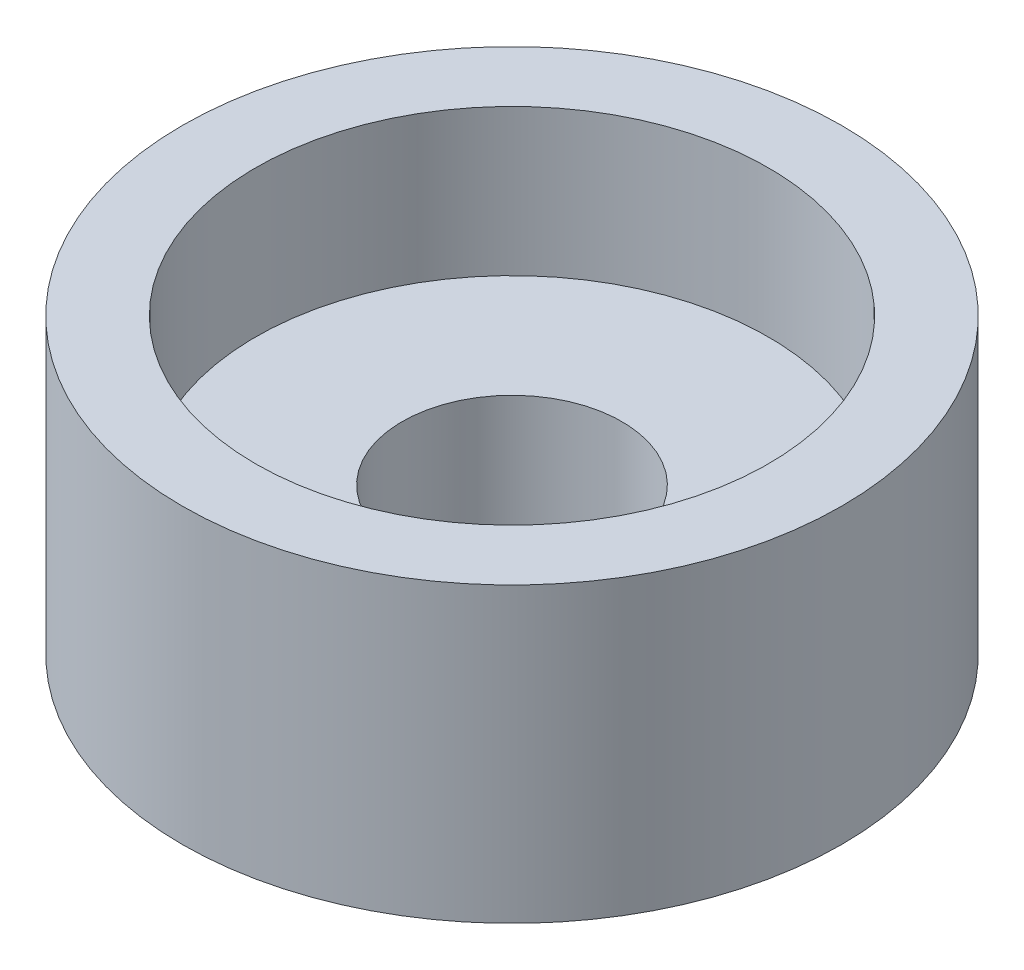
ISO-10303-21;
HEADER;
FILE_DESCRIPTION(('STEP AP214'),'2;1');
FILE_NAME('part.step','',(''),(''),'','','');
FILE_SCHEMA(('AUTOMOTIVE_DESIGN { 1 0 10303 214 1 1 1 1 }'));
ENDSEC;
DATA;
#1=APPLICATION_CONTEXT('core data for automotive mechanical design processes');
#2=APPLICATION_PROTOCOL_DEFINITION('international standard','automotive_design',2000,#1);
#3=PRODUCT_CONTEXT('',#1,'mechanical');
#4=PRODUCT('Part','Part','',(#3));
#5=PRODUCT_RELATED_PRODUCT_CATEGORY('part','',(#4));
#6=PRODUCT_DEFINITION_FORMATION('','',#4);
#7=PRODUCT_DEFINITION_CONTEXT('part definition',#1,'design');
#8=PRODUCT_DEFINITION('design','',#6,#7);
#9=PRODUCT_DEFINITION_SHAPE('','',#8);
#10=(LENGTH_UNIT() NAMED_UNIT(*) SI_UNIT(.MILLI.,.METRE.));
#11=(NAMED_UNIT(*) PLANE_ANGLE_UNIT() SI_UNIT($,.RADIAN.));
#12=(NAMED_UNIT(*) SI_UNIT($,.STERADIAN.) SOLID_ANGLE_UNIT());
#13=UNCERTAINTY_MEASURE_WITH_UNIT(LENGTH_MEASURE(1.E-05),#10,'distance_accuracy_value','');
#14=(GEOMETRIC_REPRESENTATION_CONTEXT(3) GLOBAL_UNCERTAINTY_ASSIGNED_CONTEXT((#13)) GLOBAL_UNIT_ASSIGNED_CONTEXT((#10,
#11,#12)) REPRESENTATION_CONTEXT('',''));
#15=CARTESIAN_POINT('',(0.,0.,0.));
#16=DIRECTION('',(0.,0.,1.));
#17=DIRECTION('',(1.,0.,0.));
#18=AXIS2_PLACEMENT_3D('',#15,#16,#17);
#19=CARTESIAN_POINT('',(0.,2.,0.));
#20=DIRECTION('',(0.,-1.,0.));
#21=DIRECTION('',(0.,0.,-1.));
#22=AXIS2_PLACEMENT_3D('',#19,#20,#21);
#23=CYLINDRICAL_SURFACE('',#22,4.5);
#24=CARTESIAN_POINT('',(0.,2.,0.));
#25=DIRECTION('',(0.,1.,0.));
#26=DIRECTION('',(0.,0.,1.));
#27=AXIS2_PLACEMENT_3D('',#24,#25,#26);
#28=CIRCLE('',#27,4.5);
#29=CARTESIAN_POINT('',(0.,2.,4.5));
#30=VERTEX_POINT('',#29);
#31=EDGE_CURVE('E10',#30,#30,#28,.T.);
#32=ORIENTED_EDGE('',*,*,#31,.F.);
#33=EDGE_LOOP('',(#32));
#34=FACE_BOUND('',#33,.T.);
#35=CARTESIAN_POINT('',(0.,-2.,0.));
#36=DIRECTION('',(0.,1.,0.));
#37=DIRECTION('',(0.,0.,1.));
#38=AXIS2_PLACEMENT_3D('',#35,#36,#37);
#39=CIRCLE('',#38,4.5);
#40=CARTESIAN_POINT('',(0.,-2.,4.5));
#41=VERTEX_POINT('',#40);
#42=EDGE_CURVE('E40',#41,#41,#39,.T.);
#43=ORIENTED_EDGE('',*,*,#42,.T.);
#44=EDGE_LOOP('',(#43));
#45=FACE_BOUND('',#44,.T.);
#46=ADVANCED_FACE('F37',(#34,#45),#23,.T.);
#47=CARTESIAN_POINT('',(0.,2.,0.));
#48=DIRECTION('',(0.,1.,0.));
#49=DIRECTION('',(0.,0.,1.));
#50=AXIS2_PLACEMENT_3D('',#47,#48,#49);
#51=PLANE('',#50);
#52=CARTESIAN_POINT('',(0.,2.,0.));
#53=DIRECTION('',(0.,1.,0.));
#54=DIRECTION('',(0.,0.,1.));
#55=AXIS2_PLACEMENT_3D('',#52,#53,#54);
#56=CIRCLE('',#55,3.5);
#57=CARTESIAN_POINT('',(0.,2.,3.5));
#58=VERTEX_POINT('',#57);
#59=EDGE_CURVE('E49',#58,#58,#56,.T.);
#60=ORIENTED_EDGE('',*,*,#59,.F.);
#61=EDGE_LOOP('',(#60));
#62=FACE_BOUND('',#61,.T.);
#63=ORIENTED_EDGE('',*,*,#31,.T.);
#64=EDGE_LOOP('',(#63));
#65=FACE_BOUND('',#64,.T.);
#66=ADVANCED_FACE('F82',(#62,#65),#51,.T.);
#67=CARTESIAN_POINT('',(0.,-2.,0.));
#68=DIRECTION('',(0.,1.,0.));
#69=DIRECTION('',(0.,0.,1.));
#70=AXIS2_PLACEMENT_3D('',#67,#68,#69);
#71=PLANE('',#70);
#72=CARTESIAN_POINT('',(0.,-2.,0.));
#73=DIRECTION('',(0.,1.,0.));
#74=DIRECTION('',(0.,0.,1.));
#75=AXIS2_PLACEMENT_3D('',#72,#73,#74);
#76=CIRCLE('',#75,1.5);
#77=CARTESIAN_POINT('',(0.,-2.,1.5));
#78=VERTEX_POINT('',#77);
#79=EDGE_CURVE('E52',#78,#78,#76,.T.);
#80=ORIENTED_EDGE('',*,*,#79,.T.);
#81=EDGE_LOOP('',(#80));
#82=FACE_BOUND('',#81,.T.);
#83=ORIENTED_EDGE('',*,*,#42,.F.);
#84=EDGE_LOOP('',(#83));
#85=FACE_BOUND('',#84,.T.);
#86=ADVANCED_FACE('F61',(#82,#85),#71,.F.);
#87=CARTESIAN_POINT('',(0.,0.,0.));
#88=DIRECTION('',(0.,1.,0.));
#89=DIRECTION('',(0.,0.,1.));
#90=AXIS2_PLACEMENT_3D('',#87,#88,#89);
#91=CYLINDRICAL_SURFACE('',#90,3.5);
#92=CARTESIAN_POINT('',(0.,0.,0.));
#93=DIRECTION('',(0.,1.,0.));
#94=DIRECTION('',(0.,0.,1.));
#95=AXIS2_PLACEMENT_3D('',#92,#93,#94);
#96=CIRCLE('',#95,3.5);
#97=CARTESIAN_POINT('',(0.,0.,3.5));
#98=VERTEX_POINT('',#97);
#99=EDGE_CURVE('E47',#98,#98,#96,.T.);
#100=ORIENTED_EDGE('',*,*,#99,.F.);
#101=EDGE_LOOP('',(#100));
#102=FACE_BOUND('',#101,.T.);
#103=ORIENTED_EDGE('',*,*,#59,.T.);
#104=EDGE_LOOP('',(#103));
#105=FACE_BOUND('',#104,.T.);
#106=ADVANCED_FACE('F73',(#102,#105),#91,.F.);
#107=CARTESIAN_POINT('',(0.,0.,0.));
#108=DIRECTION('',(0.,1.,0.));
#109=DIRECTION('',(0.,0.,1.));
#110=AXIS2_PLACEMENT_3D('',#107,#108,#109);
#111=PLANE('',#110);
#112=CARTESIAN_POINT('',(0.,0.,0.));
#113=DIRECTION('',(0.,1.,0.));
#114=DIRECTION('',(0.,0.,1.));
#115=AXIS2_PLACEMENT_3D('',#112,#113,#114);
#116=CIRCLE('',#115,1.5);
#117=CARTESIAN_POINT('',(0.,0.,1.5));
#118=VERTEX_POINT('',#117);
#119=EDGE_CURVE('E55',#118,#118,#116,.T.);
#120=ORIENTED_EDGE('',*,*,#119,.F.);
#121=EDGE_LOOP('',(#120));
#122=FACE_BOUND('',#121,.T.);
#123=ORIENTED_EDGE('',*,*,#99,.T.);
#124=EDGE_LOOP('',(#123));
#125=FACE_BOUND('',#124,.T.);
#126=ADVANCED_FACE('F67',(#122,#125),#111,.T.);
#127=CARTESIAN_POINT('',(0.,-2.,0.));
#128=DIRECTION('',(0.,1.,0.));
#129=DIRECTION('',(0.,0.,1.));
#130=AXIS2_PLACEMENT_3D('',#127,#128,#129);
#131=CYLINDRICAL_SURFACE('',#130,1.5);
#132=ORIENTED_EDGE('',*,*,#79,.F.);
#133=EDGE_LOOP('',(#132));
#134=FACE_BOUND('',#133,.T.);
#135=ORIENTED_EDGE('',*,*,#119,.T.);
#136=EDGE_LOOP('',(#135));
#137=FACE_BOUND('',#136,.T.);
#138=ADVANCED_FACE('F64',(#134,#137),#131,.F.);
#139=CLOSED_SHELL('',(#46,#66,#86,#106,#126,#138));
#140=MANIFOLD_SOLID_BREP('B2',#139);
#141=ADVANCED_BREP_SHAPE_REPRESENTATION('',(#18,#140),#14);
#142=SHAPE_DEFINITION_REPRESENTATION(#9,#141);
ENDSEC;
END-ISO-10303-21;
